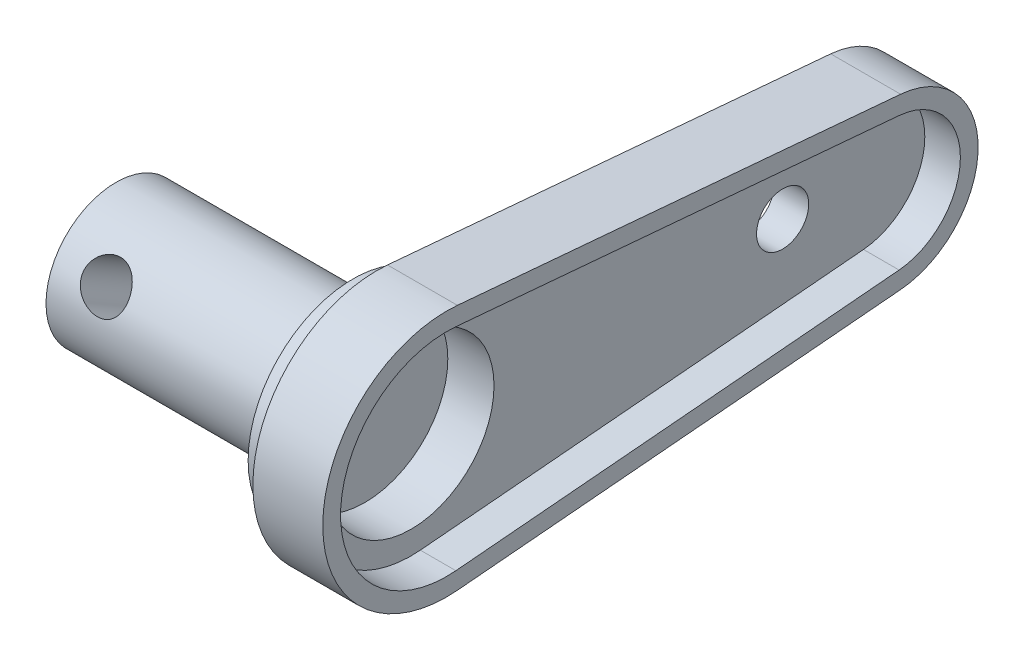
ISO-10303-21;
HEADER;
FILE_DESCRIPTION(('STEP AP214'),'2;1');
FILE_NAME('part.step','',(''),(''),'','','');
FILE_SCHEMA(('AUTOMOTIVE_DESIGN { 1 0 10303 214 1 1 1 1 }'));
ENDSEC;
DATA;
#1=APPLICATION_CONTEXT('core data for automotive mechanical design processes');
#2=APPLICATION_PROTOCOL_DEFINITION('international standard','automotive_design',2000,#1);
#3=PRODUCT_CONTEXT('',#1,'mechanical');
#4=PRODUCT('Part','Part','',(#3));
#5=PRODUCT_RELATED_PRODUCT_CATEGORY('part','',(#4));
#6=PRODUCT_DEFINITION_FORMATION('','',#4);
#7=PRODUCT_DEFINITION_CONTEXT('part definition',#1,'design');
#8=PRODUCT_DEFINITION('design','',#6,#7);
#9=PRODUCT_DEFINITION_SHAPE('','',#8);
#10=(LENGTH_UNIT() NAMED_UNIT(*) SI_UNIT(.MILLI.,.METRE.));
#11=(NAMED_UNIT(*) PLANE_ANGLE_UNIT() SI_UNIT($,.RADIAN.));
#12=(NAMED_UNIT(*) SI_UNIT($,.STERADIAN.) SOLID_ANGLE_UNIT());
#13=UNCERTAINTY_MEASURE_WITH_UNIT(LENGTH_MEASURE(1.E-05),#10,'distance_accuracy_value','');
#14=(GEOMETRIC_REPRESENTATION_CONTEXT(3) GLOBAL_UNCERTAINTY_ASSIGNED_CONTEXT((#13)) GLOBAL_UNIT_ASSIGNED_CONTEXT((#10,
#11,#12)) REPRESENTATION_CONTEXT('',''));
#15=CARTESIAN_POINT('',(0.,0.,0.));
#16=DIRECTION('',(0.,0.,1.));
#17=DIRECTION('',(1.,0.,0.));
#18=AXIS2_PLACEMENT_3D('',#15,#16,#17);
#19=CARTESIAN_POINT('',(0.,0.,-5.3086));
#20=DIRECTION('',(1.,0.,0.));
#21=DIRECTION('',(0.,0.,-1.));
#22=AXIS2_PLACEMENT_3D('',#19,#20,#21);
#23=PLANE('',#22);
#24=CARTESIAN_POINT('',(0.,0.,-21.2344));
#25=DIRECTION('',(1.,0.,0.));
#26=DIRECTION('',(0.,0.,-1.));
#27=AXIS2_PLACEMENT_3D('',#24,#25,#26);
#28=CIRCLE('',#27,1.1176);
#29=CARTESIAN_POINT('',(0.,0.,-22.352));
#30=VERTEX_POINT('',#29);
#31=EDGE_CURVE('E386',#30,#30,#28,.T.);
#32=ORIENTED_EDGE('',*,*,#31,.T.);
#33=EDGE_LOOP('',(#32));
#34=FACE_BOUND('',#33,.T.);
#35=CARTESIAN_POINT('',(0.,0.,-5.3086));
#36=DIRECTION('',(1.,0.,0.));
#37=DIRECTION('',(0.,0.,-1.));
#38=AXIS2_PLACEMENT_3D('',#35,#36,#37);
#39=CIRCLE('',#38,5.3086);
#40=CARTESIAN_POINT('',(0.,5.28839917428984,-5.77127497595018));
#41=VERTEX_POINT('',#40);
#42=CARTESIAN_POINT('',(0.,-5.28839917428984,-5.77127497595018));
#43=VERTEX_POINT('',#42);
#44=EDGE_CURVE('E164',#41,#43,#39,.T.);
#45=ORIENTED_EDGE('',*,*,#44,.F.);
#46=DIRECTION('',(0.,0.0871557427476513,0.996194698091746));
#47=VECTOR('',#46,1.);
#48=CARTESIAN_POINT('',(0.,3.62626644449713,-24.7695390116139));
#49=LINE('',#48,#47);
#50=CARTESIAN_POINT('',(0.,3.62626644449713,-24.7695390116139));
#51=VERTEX_POINT('',#50);
#52=EDGE_CURVE('E85',#51,#41,#49,.T.);
#53=ORIENTED_EDGE('',*,*,#52,.F.);
#54=CARTESIAN_POINT('',(0.,0.,-24.452281806796));
#55=DIRECTION('',(1.,0.,0.));
#56=DIRECTION('',(0.,0.,-1.));
#57=AXIS2_PLACEMENT_3D('',#54,#55,#56);
#58=CIRCLE('',#57,3.64011819320399);
#59=CARTESIAN_POINT('',(0.,-3.62626644449712,-24.7695390116139));
#60=VERTEX_POINT('',#59);
#61=EDGE_CURVE('E176',#60,#51,#58,.T.);
#62=ORIENTED_EDGE('',*,*,#61,.F.);
#63=DIRECTION('',(0.,0.0871557427476515,-0.996194698091746));
#64=VECTOR('',#63,1.);
#65=CARTESIAN_POINT('',(0.,-3.62626644449712,-24.7695390116139));
#66=LINE('',#65,#64);
#67=EDGE_CURVE('E174',#43,#60,#66,.T.);
#68=ORIENTED_EDGE('',*,*,#67,.F.);
#69=EDGE_LOOP('',(#45,#53,#62,#68));
#70=FACE_BOUND('',#69,.T.);
#71=CARTESIAN_POINT('',(0.,0.,-5.3086));
#72=DIRECTION('',(1.,0.,0.));
#73=DIRECTION('',(0.,0.,-1.));
#74=AXIS2_PLACEMENT_3D('',#71,#72,#73);
#75=CIRCLE('',#74,4.4958);
#76=CARTESIAN_POINT('',(0.,0.,-9.8044));
#77=VERTEX_POINT('',#76);
#78=EDGE_CURVE('E11',#77,#77,#75,.F.);
#79=ORIENTED_EDGE('',*,*,#78,.F.);
#80=EDGE_LOOP('',(#79));
#81=FACE_BOUND('',#80,.T.);
#82=ADVANCED_FACE('F33',(#34,#70,#81),#23,.F.);
#83=CARTESIAN_POINT('',(2.9972,0.,-5.3086));
#84=DIRECTION('',(-1.,0.,0.));
#85=DIRECTION('',(0.,0.,1.));
#86=AXIS2_PLACEMENT_3D('',#83,#84,#85);
#87=CYLINDRICAL_SURFACE('',#86,5.3086);
#88=ORIENTED_EDGE('',*,*,#44,.T.);
#89=DIRECTION('',(-1.,0.,0.));
#90=VECTOR('',#89,1.);
#91=CARTESIAN_POINT('',(2.9972,-5.28839917428984,-5.77127497595018));
#92=LINE('',#91,#90);
#93=CARTESIAN_POINT('',(2.9972,-5.28839917428984,-5.77127497595018));
#94=VERTEX_POINT('',#93);
#95=EDGE_CURVE('E47',#94,#43,#92,.T.);
#96=ORIENTED_EDGE('',*,*,#95,.F.);
#97=CARTESIAN_POINT('',(2.9972,0.,-5.3086));
#98=DIRECTION('',(1.,0.,0.));
#99=DIRECTION('',(0.,0.,-1.));
#100=AXIS2_PLACEMENT_3D('',#97,#98,#99);
#101=CIRCLE('',#100,5.3086);
#102=CARTESIAN_POINT('',(2.9972,5.28839917428984,-5.77127497595018));
#103=VERTEX_POINT('',#102);
#104=EDGE_CURVE('E165',#103,#94,#101,.T.);
#105=ORIENTED_EDGE('',*,*,#104,.F.);
#106=DIRECTION('',(-1.,0.,0.));
#107=VECTOR('',#106,1.);
#108=CARTESIAN_POINT('',(2.9972,5.28839917428984,-5.77127497595018));
#109=LINE('',#108,#107);
#110=EDGE_CURVE('E171',#103,#41,#109,.T.);
#111=ORIENTED_EDGE('',*,*,#110,.T.);
#112=EDGE_LOOP('',(#88,#96,#105,#111));
#113=FACE_BOUND('',#112,.T.);
#114=ADVANCED_FACE('F35',(#113),#87,.T.);
#115=CARTESIAN_POINT('',(2.9972,-3.62626644449712,-24.7695390116139));
#116=DIRECTION('',(0.,0.996194698091746,0.0871557427476515));
#117=DIRECTION('',(0.,-0.0871557427476515,0.996194698091746));
#118=AXIS2_PLACEMENT_3D('',#115,#116,#117);
#119=PLANE('',#118);
#120=ORIENTED_EDGE('',*,*,#67,.T.);
#121=DIRECTION('',(-1.,0.,0.));
#122=VECTOR('',#121,1.);
#123=CARTESIAN_POINT('',(2.9972,-3.62626644449712,-24.7695390116139));
#124=LINE('',#123,#122);
#125=CARTESIAN_POINT('',(2.9972,-3.62626644449712,-24.7695390116139));
#126=VERTEX_POINT('',#125);
#127=EDGE_CURVE('E182',#126,#60,#124,.T.);
#128=ORIENTED_EDGE('',*,*,#127,.F.);
#129=DIRECTION('',(0.,0.0871557427476515,-0.996194698091746));
#130=VECTOR('',#129,1.);
#131=CARTESIAN_POINT('',(2.9972,-3.62626644449712,-24.7695390116139));
#132=LINE('',#131,#130);
#133=EDGE_CURVE('E93',#94,#126,#132,.T.);
#134=ORIENTED_EDGE('',*,*,#133,.F.);
#135=ORIENTED_EDGE('',*,*,#95,.T.);
#136=EDGE_LOOP('',(#120,#128,#134,#135));
#137=FACE_BOUND('',#136,.T.);
#138=ADVANCED_FACE('F251',(#137),#119,.F.);
#139=CARTESIAN_POINT('',(2.9972,0.,-24.452281806796));
#140=DIRECTION('',(-1.,0.,0.));
#141=DIRECTION('',(0.,0.,1.));
#142=AXIS2_PLACEMENT_3D('',#139,#140,#141);
#143=CYLINDRICAL_SURFACE('',#142,3.64011819320399);
#144=ORIENTED_EDGE('',*,*,#61,.T.);
#145=DIRECTION('',(-1.,0.,0.));
#146=VECTOR('',#145,1.);
#147=CARTESIAN_POINT('',(2.9972,3.62626644449713,-24.7695390116139));
#148=LINE('',#147,#146);
#149=CARTESIAN_POINT('',(2.9972,3.62626644449713,-24.7695390116139));
#150=VERTEX_POINT('',#149);
#151=EDGE_CURVE('E180',#150,#51,#148,.T.);
#152=ORIENTED_EDGE('',*,*,#151,.F.);
#153=CARTESIAN_POINT('',(2.9972,0.,-24.452281806796));
#154=DIRECTION('',(1.,0.,0.));
#155=DIRECTION('',(0.,0.,-1.));
#156=AXIS2_PLACEMENT_3D('',#153,#154,#155);
#157=CIRCLE('',#156,3.64011819320399);
#158=EDGE_CURVE('E168',#126,#150,#157,.T.);
#159=ORIENTED_EDGE('',*,*,#158,.F.);
#160=ORIENTED_EDGE('',*,*,#127,.T.);
#161=EDGE_LOOP('',(#144,#152,#159,#160));
#162=FACE_BOUND('',#161,.T.);
#163=ADVANCED_FACE('F259',(#162),#143,.T.);
#164=CARTESIAN_POINT('',(2.9972,3.62626644449713,-24.7695390116139));
#165=DIRECTION('',(0.,-0.996194698091746,0.0871557427476513));
#166=DIRECTION('',(0.,-0.0871557427476513,-0.996194698091746));
#167=AXIS2_PLACEMENT_3D('',#164,#165,#166);
#168=PLANE('',#167);
#169=ORIENTED_EDGE('',*,*,#52,.T.);
#170=ORIENTED_EDGE('',*,*,#110,.F.);
#171=DIRECTION('',(0.,0.0871557427476513,0.996194698091746));
#172=VECTOR('',#171,1.);
#173=CARTESIAN_POINT('',(2.9972,3.62626644449713,-24.7695390116139));
#174=LINE('',#173,#172);
#175=EDGE_CURVE('E64',#150,#103,#174,.T.);
#176=ORIENTED_EDGE('',*,*,#175,.F.);
#177=ORIENTED_EDGE('',*,*,#151,.T.);
#178=EDGE_LOOP('',(#169,#170,#176,#177));
#179=FACE_BOUND('',#178,.T.);
#180=ADVANCED_FACE('F256',(#179),#168,.F.);
#181=CARTESIAN_POINT('',(2.9972,0.,-5.3086));
#182=DIRECTION('',(1.,0.,0.));
#183=DIRECTION('',(0.,0.,-1.));
#184=AXIS2_PLACEMENT_3D('',#181,#182,#183);
#185=PLANE('',#184);
#186=CARTESIAN_POINT('',(2.9972,0.,-24.452281806796));
#187=DIRECTION('',(1.,0.,0.));
#188=DIRECTION('',(0.,0.,-1.));
#189=AXIS2_PLACEMENT_3D('',#186,#187,#188);
#190=CIRCLE('',#189,2.87811819320399);
#191=CARTESIAN_POINT('',(2.9972,-2.86716608455121,-24.7031263356402));
#192=VERTEX_POINT('',#191);
#193=CARTESIAN_POINT('',(2.9972,2.86716608455121,-24.7031263356402));
#194=VERTEX_POINT('',#193);
#195=EDGE_CURVE('E55',#192,#194,#190,.T.);
#196=ORIENTED_EDGE('',*,*,#195,.F.);
#197=DIRECTION('',(0.,0.0871557427476516,-0.996194698091746));
#198=VECTOR('',#197,1.);
#199=CARTESIAN_POINT('',(2.9972,-4.52929881434393,-5.70486229997647));
#200=LINE('',#199,#198);
#201=CARTESIAN_POINT('',(2.9972,-4.52929881434393,-5.70486229997647));
#202=VERTEX_POINT('',#201);
#203=EDGE_CURVE('E135',#202,#192,#200,.T.);
#204=ORIENTED_EDGE('',*,*,#203,.F.);
#205=CARTESIAN_POINT('',(2.9972,0.,-5.3086));
#206=DIRECTION('',(1.,0.,0.));
#207=DIRECTION('',(0.,0.,-1.));
#208=AXIS2_PLACEMENT_3D('',#205,#206,#207);
#209=CIRCLE('',#208,4.5466);
#210=CARTESIAN_POINT('',(2.9972,4.52929881434393,-5.70486229997647));
#211=VERTEX_POINT('',#210);
#212=EDGE_CURVE('E138',#211,#202,#209,.T.);
#213=ORIENTED_EDGE('',*,*,#212,.F.);
#214=DIRECTION('',(0.,0.0871557427476513,0.996194698091746));
#215=VECTOR('',#214,1.);
#216=CARTESIAN_POINT('',(2.9972,2.86716608455122,-24.7031263356402));
#217=LINE('',#216,#215);
#218=EDGE_CURVE('E147',#194,#211,#217,.T.);
#219=ORIENTED_EDGE('',*,*,#218,.F.);
#220=EDGE_LOOP('',(#196,#204,#213,#219));
#221=FACE_BOUND('',#220,.T.);
#222=ORIENTED_EDGE('',*,*,#104,.T.);
#223=ORIENTED_EDGE('',*,*,#133,.T.);
#224=ORIENTED_EDGE('',*,*,#158,.T.);
#225=ORIENTED_EDGE('',*,*,#175,.T.);
#226=EDGE_LOOP('',(#222,#223,#224,#225));
#227=FACE_BOUND('',#226,.T.);
#228=ADVANCED_FACE('F233',(#221,#227),#185,.T.);
#229=CARTESIAN_POINT('',(-1.016,0.,-5.3086));
#230=DIRECTION('',(-1.,0.,0.));
#231=DIRECTION('',(0.,0.,1.));
#232=AXIS2_PLACEMENT_3D('',#229,#230,#231);
#233=PLANE('',#232);
#234=CARTESIAN_POINT('',(-1.016,0.,-5.3086));
#235=DIRECTION('',(-1.,0.,0.));
#236=DIRECTION('',(0.,0.,1.));
#237=AXIS2_PLACEMENT_3D('',#234,#235,#236);
#238=CIRCLE('',#237,4.4958);
#239=CARTESIAN_POINT('',(-1.016,0.,-0.8128));
#240=VERTEX_POINT('',#239);
#241=EDGE_CURVE('E154',#240,#240,#238,.T.);
#242=ORIENTED_EDGE('',*,*,#241,.T.);
#243=EDGE_LOOP('',(#242));
#244=FACE_BOUND('',#243,.T.);
#245=CARTESIAN_POINT('',(-1.016,0.,-5.3086));
#246=DIRECTION('',(-1.,0.,0.));
#247=DIRECTION('',(0.,0.,1.));
#248=AXIS2_PLACEMENT_3D('',#245,#246,#247);
#249=CIRCLE('',#248,3.);
#250=CARTESIAN_POINT('',(-1.016,0.,-2.3086));
#251=VERTEX_POINT('',#250);
#252=EDGE_CURVE('E160',#251,#251,#249,.T.);
#253=ORIENTED_EDGE('',*,*,#252,.F.);
#254=EDGE_LOOP('',(#253));
#255=FACE_BOUND('',#254,.T.);
#256=ADVANCED_FACE('F229',(#244,#255),#233,.T.);
#257=CARTESIAN_POINT('',(-1.016,0.,-5.3086));
#258=DIRECTION('',(1.,0.,0.));
#259=DIRECTION('',(0.,0.,-1.));
#260=AXIS2_PLACEMENT_3D('',#257,#258,#259);
#261=CYLINDRICAL_SURFACE('',#260,4.4958);
#262=ORIENTED_EDGE('',*,*,#241,.F.);
#263=EDGE_LOOP('',(#262));
#264=FACE_BOUND('',#263,.T.);
#265=ORIENTED_EDGE('',*,*,#78,.T.);
#266=EDGE_LOOP('',(#265));
#267=FACE_BOUND('',#266,.T.);
#268=ADVANCED_FACE('F232',(#264,#267),#261,.T.);
#269=CARTESIAN_POINT('',(-11.176,0.,-5.3086));
#270=DIRECTION('',(-1.,0.,0.));
#271=DIRECTION('',(0.,0.,1.));
#272=AXIS2_PLACEMENT_3D('',#269,#270,#271);
#273=PLANE('',#272);
#274=CARTESIAN_POINT('',(-11.176,0.,-5.3086));
#275=DIRECTION('',(-1.,0.,0.));
#276=DIRECTION('',(0.,0.,1.));
#277=AXIS2_PLACEMENT_3D('',#274,#275,#276);
#278=CIRCLE('',#277,3.);
#279=CARTESIAN_POINT('',(-11.176,0.,-2.3086));
#280=VERTEX_POINT('',#279);
#281=EDGE_CURVE('E161',#280,#280,#278,.T.);
#282=ORIENTED_EDGE('',*,*,#281,.T.);
#283=EDGE_LOOP('',(#282));
#284=FACE_BOUND('',#283,.T.);
#285=ADVANCED_FACE('F236',(#284),#273,.T.);
#286=CARTESIAN_POINT('',(-11.176,0.,-5.3086));
#287=DIRECTION('',(1.,0.,0.));
#288=DIRECTION('',(0.,0.,-1.));
#289=AXIS2_PLACEMENT_3D('',#286,#287,#288);
#290=CYLINDRICAL_SURFACE('',#289,3.);
#291=CARTESIAN_POINT('',(-9.02281429492282,2.27375125233858,-3.35154730717624));
#292=CARTESIAN_POINT('',(-8.96882599333698,2.2737513401527,-3.351547460472));
#293=CARTESIAN_POINT('',(-8.91483841117992,2.27069646086252,-3.34798131268195));
#294=CARTESIAN_POINT('',(-8.80846063520607,2.25852863410597,-3.33397789945316));
#295=CARTESIAN_POINT('',(-8.75607073137423,2.2494145936421,-3.32353939432971));
#296=CARTESIAN_POINT('',(-8.6544462334213,2.22528838666123,-3.29653248021309));
#297=CARTESIAN_POINT('',(-8.60520576191764,2.21028760288604,-3.2799759048454));
#298=CARTESIAN_POINT('',(-8.5109764196512,2.17456874030488,-3.24173452135225));
#299=CARTESIAN_POINT('',(-8.46598846212337,2.15384943716452,-3.22004861517998));
#300=CARTESIAN_POINT('',(-8.37981423361891,2.106082992887,-3.17187306841398));
#301=CARTESIAN_POINT('',(-8.33881503710414,2.07884052811069,-3.14524238094658));
#302=CARTESIAN_POINT('',(-8.26346092665725,2.01874272341074,-3.08905772329985));
#303=CARTESIAN_POINT('',(-8.22910705737631,1.98588650252618,-3.05950329460777));
#304=CARTESIAN_POINT('',(-8.16717354673548,1.91406745026138,-2.99805193824378));
#305=CARTESIAN_POINT('',(-8.13978940075846,1.87497005005964,-2.96611445414099));
#306=CARTESIAN_POINT('',(-8.0938652261702,1.79201367809266,-2.9020613996955));
#307=CARTESIAN_POINT('',(-8.07532286140982,1.74815596784623,-2.86994587866437));
#308=CARTESIAN_POINT('',(-8.04824148741459,1.65828753952057,-2.80800860465632));
#309=CARTESIAN_POINT('',(-8.03938211765242,1.61240171291006,-2.77814596914899));
#310=CARTESIAN_POINT('',(-8.03090014227165,1.51842931852543,-2.72066590038311));
#311=CARTESIAN_POINT('',(-8.03127519939964,1.47034331069736,-2.69304790077784));
#312=CARTESIAN_POINT('',(-8.04104706980799,1.37533616137332,-2.64190706967833));
#313=CARTESIAN_POINT('',(-8.05009602319561,1.32844143857471,-2.61826751831073));
#314=CARTESIAN_POINT('',(-8.07638425381781,1.2354086726359,-2.57429676970305));
#315=CARTESIAN_POINT('',(-8.09362408337833,1.18927068074054,-2.5539657956906));
#316=CARTESIAN_POINT('',(-8.13601089731258,1.09855272466346,-2.51653567921448));
#317=CARTESIAN_POINT('',(-8.16125787482924,1.05400085419633,-2.49948204380511));
#318=CARTESIAN_POINT('',(-8.2188602494711,0.968436924348443,-2.46884679162985));
#319=CARTESIAN_POINT('',(-8.25121759692587,0.927425840490518,-2.45526612969442));
#320=CARTESIAN_POINT('',(-8.32388026522002,0.848413710361817,-2.43075619620752));
#321=CARTESIAN_POINT('',(-8.36448398348211,0.810639628375747,-2.41997861557512));
#322=CARTESIAN_POINT('',(-8.45158739531225,0.741695252439023,-2.40151121061367));
#323=CARTESIAN_POINT('',(-8.49808796092097,0.710525937042571,-2.39382184367971));
#324=CARTESIAN_POINT('',(-8.59651380394118,0.655687724294921,-2.38099332890171));
#325=CARTESIAN_POINT('',(-8.64850491408149,0.632127920104444,-2.37589072329457));
#326=CARTESIAN_POINT('',(-8.75591831972087,0.594271814729807,-2.3679845199029));
#327=CARTESIAN_POINT('',(-8.8113391991853,0.579971718115503,-2.36517998004671));
#328=CARTESIAN_POINT('',(-8.92140471924148,0.56183968274621,-2.36166630828682));
#329=CARTESIAN_POINT('',(-8.97597471303855,0.557571465253198,-2.36086973262502));
#330=CARTESIAN_POINT('',(-9.08502988054923,0.558454088841843,-2.36103663919855));
#331=CARTESIAN_POINT('',(-9.1395150675868,0.563603259946168,-2.36199980937966));
#332=CARTESIAN_POINT('',(-9.24495233717637,0.582702490105141,-2.36571944391878));
#333=CARTESIAN_POINT('',(-9.29596163406785,0.596352045731576,-2.36841477332805));
#334=CARTESIAN_POINT('',(-9.39503708757096,0.631520909990904,-2.37576828413802));
#335=CARTESIAN_POINT('',(-9.44310272691563,0.653041597153053,-2.38042680938942));
#336=CARTESIAN_POINT('',(-9.53659148499556,0.703834260102685,-2.39221260935258));
#337=CARTESIAN_POINT('',(-9.58188500473392,0.733327539388653,-2.3994125144253));
#338=CARTESIAN_POINT('',(-9.66709163510137,0.79859790392257,-2.41664928388353));
#339=CARTESIAN_POINT('',(-9.70700318258783,0.834376807851948,-2.42668696986553));
#340=CARTESIAN_POINT('',(-9.78225395549449,0.91282034865769,-2.4505386965886));
#341=CARTESIAN_POINT('',(-9.81728954802053,0.955729819987472,-2.46450824633636));
#342=CARTESIAN_POINT('',(-9.87947398616785,1.04564165915334,-2.49632258228216));
#343=CARTESIAN_POINT('',(-9.90662312679205,1.09264387380956,-2.51416722348375));
#344=CARTESIAN_POINT('',(-9.95201312308183,1.18882541513841,-2.55371767922223));
#345=CARTESIAN_POINT('',(-9.9703132087891,1.23798779404763,-2.57539645633666));
#346=CARTESIAN_POINT('',(-9.99759761191331,1.33709699823069,-2.62249193454805));
#347=CARTESIAN_POINT('',(-10.0065852221715,1.38704353988283,-2.64790731077135));
#348=CARTESIAN_POINT('',(-10.0146975507053,1.48373369655413,-2.70064536498203));
#349=CARTESIAN_POINT('',(-10.0142585525912,1.53051870989371,-2.72782577153506));
#350=CARTESIAN_POINT('',(-10.0046030801775,1.62188427078871,-2.78424392184953));
#351=CARTESIAN_POINT('',(-9.99538729562462,1.66646499128466,-2.81348150377524));
#352=CARTESIAN_POINT('',(-9.96872760935794,1.75160689286988,-2.87251325443431));
#353=CARTESIAN_POINT('',(-9.95141209694069,1.79221924357885,-2.9022920048344));
#354=CARTESIAN_POINT('',(-9.90916285877788,1.86936648313467,-2.96172064694866));
#355=CARTESIAN_POINT('',(-9.88422776404692,1.90590063765364,-2.9913705145352));
#356=CARTESIAN_POINT('',(-9.82639839922083,1.97556462971222,-3.05043549408569));
#357=CARTESIAN_POINT('',(-9.7932467779901,2.00852147670584,-3.07980251258378));
#358=CARTESIAN_POINT('',(-9.72036563262097,2.06902090854903,-3.13584684037003));
#359=CARTESIAN_POINT('',(-9.68063402978038,2.09656177638644,-3.16252329537522));
#360=CARTESIAN_POINT('',(-9.59390507397892,2.14687860510665,-3.21283563253933));
#361=CARTESIAN_POINT('',(-9.54668813040998,2.16943233036822,-3.23631641717761));
#362=CARTESIAN_POINT('',(-9.4473882211295,2.20812114283178,-3.27758910280712));
#363=CARTESIAN_POINT('',(-9.39530664393795,2.2242580547231,-3.29538262075051));
#364=CARTESIAN_POINT('',(-9.29048532305581,2.24924197398837,-3.32334288912259));
#365=CARTESIAN_POINT('',(-9.23791702654396,2.25842106808866,-3.33385466490221));
#366=CARTESIAN_POINT('',(-9.13116998718577,2.27067466144348,-3.34795566103203));
#367=CARTESIAN_POINT('',(-9.07699177881452,2.27375116421675,-3.35154715334331));
#368=CARTESIAN_POINT('',(-9.02281429492282,2.27375125233858,-3.35154730717624));
#369=B_SPLINE_CURVE_WITH_KNOTS('',3,(#291,#292,#293,#294,#295,#296,#297,#298,#299,#300,#301,
#302,#303,#304,#305,#306,#307,#308,#309,#310,#311,#312,#313,#314,#315,#316,#317,#318,#319,#320,
#321,#322,#323,#324,#325,#326,#327,#328,#329,#330,#331,#332,#333,#334,#335,#336,#337,#338,#339,
#340,#341,#342,#343,#344,#345,#346,#347,#348,#349,#350,#351,#352,#353,#354,#355,#356,#357,#358,
#359,#360,#361,#362,#363,#364,#365,#366,#367,#368),.UNSPECIFIED.,.T.,.F.,(4,2,2,2,2,2,2,2,2,2,2,
2,2,2,2,2,2,2,2,2,2,2,2,2,2,2,2,2,2,2,2,2,2,2,2,2,2,2,4),(0.,0.161764353083448,
0.323557894370165,0.485040117364984,0.646556940541795,0.813701386305407,0.980872086005241,
1.15231375342525,1.32371009790358,1.48924598908346,1.65473998320213,1.81386307380458,
1.97299689589496,2.13420188269334,2.29545114231804,2.4641587673663,2.63289137048183,
2.80394544926635,2.97492937081837,3.13832749541807,3.30169664757974,3.45959480828861,
3.61752063611802,3.78038391476333,3.9432943940826,4.11387280117939,4.28444482674847,
4.45385877865095,4.62321280622759,4.78474639914285,4.94626729856508,5.10531044155265,
5.26438217611829,5.42926161007596,5.59419323131178,5.76542589931705,5.93660984060672,
6.09899435852551,6.26132555576637),.UNSPECIFIED.);
#370=CARTESIAN_POINT('',(-9.02281429492282,2.27375125233858,-3.35154730717624));
#371=VERTEX_POINT('',#370);
#372=EDGE_CURVE('E37',#371,#371,#369,.T.);
#373=ORIENTED_EDGE('',*,*,#372,.T.);
#374=EDGE_LOOP('',(#373));
#375=FACE_BOUND('',#374,.T.);
#376=CARTESIAN_POINT('',(-9.02281429492282,-0.557981722360858,-8.25625269282377));
#377=CARTESIAN_POINT('',(-9.07680259650865,-0.557981545695774,-8.25625269222515));
#378=CARTESIAN_POINT('',(-9.13079017866572,-0.562597359920702,-8.25539016304938));
#379=CARTESIAN_POINT('',(-9.23716795463957,-0.580808584894789,-8.25185422258375));
#380=CARTESIAN_POINT('',(-9.28955785847141,-0.594405615741168,-8.24918048457264));
#381=CARTESIAN_POINT('',(-9.39118235642434,-0.629857392934425,-8.24179003348856));
#382=CARTESIAN_POINT('',(-9.440422827928,-0.651696199690114,-8.23707726134642));
#383=CARTESIAN_POINT('',(-9.53465217019444,-0.70267364056162,-8.22526451070342));
#384=CARTESIAN_POINT('',(-9.57964012772227,-0.731813837781073,-8.21816402092129));
#385=CARTESIAN_POINT('',(-9.66581435622673,-0.797418307260397,-8.20088484011151));
#386=CARTESIAN_POINT('',(-9.7068135527415,-0.834102391515563,-8.19060751728721));
#387=CARTESIAN_POINT('',(-9.78216766318839,-0.912808634690539,-8.16665362052874));
#388=CARTESIAN_POINT('',(-9.81652153246933,-0.954831631174491,-8.15297651291641));
#389=CARTESIAN_POINT('',(-9.87845504311016,-1.04395959301512,-8.12150506736136));
#390=CARTESIAN_POINT('',(-9.90583918908718,-1.09116696568196,-8.10361446761612));
#391=CARTESIAN_POINT('',(-9.95176336367544,-1.18811672400523,-8.06379866930967));
#392=CARTESIAN_POINT('',(-9.97030572843582,-1.23785843619718,-8.04187453860001));
#393=CARTESIAN_POINT('',(-9.99738710243105,-1.33643190309215,-7.99501483367583));
#394=CARTESIAN_POINT('',(-10.0062464721932,-1.3852366173707,-7.97020785991114));
#395=CARTESIAN_POINT('',(-10.014728447574,-1.48200201432554,-7.91756541350255));
#396=CARTESIAN_POINT('',(-10.014353390446,-1.52996290749946,-7.8897307089595));
#397=CARTESIAN_POINT('',(-10.0045815200377,-1.62175574106429,-7.83302251965349));
#398=CARTESIAN_POINT('',(-9.99553256665003,-1.66567555448201,-7.80423027409027));
#399=CARTESIAN_POINT('',(-9.96924433602783,-1.75027172276909,-7.74564690970676));
#400=CARTESIAN_POINT('',(-9.95200450646731,-1.79094785869523,-7.715855723652));
#401=CARTESIAN_POINT('',(-9.90961769253306,-1.86872226846869,-7.65600672734791));
#402=CARTESIAN_POINT('',(-9.8843707150164,-1.90576708519365,-7.62595049344194));
#403=CARTESIAN_POINT('',(-9.82676834037454,-1.97507995675272,-7.56716758263368));
#404=CARTESIAN_POINT('',(-9.79441099291977,-2.00734669691797,-7.53844127314369));
#405=CARTESIAN_POINT('',(-9.72174832462561,-2.06807898702704,-7.48226972798857));
#406=CARTESIAN_POINT('',(-9.68114460636353,-2.09629968663907,-7.45494520370019));
#407=CARTESIAN_POINT('',(-9.59404119453339,-2.14676511644602,-7.40447132517165));
#408=CARTESIAN_POINT('',(-9.54754062892467,-2.16900896124808,-7.38132258968673));
#409=CARTESIAN_POINT('',(-9.44911478590446,-2.20753788731247,-7.34024556173813));
#410=CARTESIAN_POINT('',(-9.39712367576415,-2.22373677548899,-7.32239347560456));
#411=CARTESIAN_POINT('',(-9.28971027012477,-2.24951180116098,-7.29356222835762));
#412=CARTESIAN_POINT('',(-9.23428939066034,-2.25909065222952,-7.28258025134116));
#413=CARTESIAN_POINT('',(-9.12422387060415,-2.27119959891879,-7.26863428396898));
#414=CARTESIAN_POINT('',(-9.06965387680709,-2.27402356242445,-7.26533618702205));
#415=CARTESIAN_POINT('',(-8.96059870929641,-2.27343770529739,-7.26601710818503));
#416=CARTESIAN_POINT('',(-8.90611352225883,-2.27002898990021,-7.26999483607925));
#417=CARTESIAN_POINT('',(-8.80067625266927,-2.25725807681706,-7.28467543732009));
#418=CARTESIAN_POINT('',(-8.74966695577779,-2.24809907526384,-7.29514863453832));
#419=CARTESIAN_POINT('',(-8.65059150227467,-2.22414631596575,-7.32192900900416));
#420=CARTESIAN_POINT('',(-8.60252586293001,-2.20935157117279,-7.33823720816778));
#421=CARTESIAN_POINT('',(-8.50903710485008,-2.17374843752596,-7.37633204462644));
#422=CARTESIAN_POINT('',(-8.46374358511172,-2.15276649718516,-7.39827402119263));
#423=CARTESIAN_POINT('',(-8.37853695474427,-2.1052038346882,-7.44618143026416));
#424=CARTESIAN_POINT('',(-8.33862540725781,-2.07862149166788,-7.47214802699557));
#425=CARTESIAN_POINT('',(-8.26337463435115,-2.01874351999871,-7.52815626273461));
#426=CARTESIAN_POINT('',(-8.22833904182511,-1.98519079937283,-7.55833218009528));
#427=CARTESIAN_POINT('',(-8.16615460367779,-1.9126828566563,-7.620290948941));
#428=CARTESIAN_POINT('',(-8.13900546305359,-1.8737278367262,-7.65207374026663));
#429=CARTESIAN_POINT('',(-8.09361546676381,-1.791385366661,-7.71559417056331));
#430=CARTESIAN_POINT('',(-8.07531538105654,-1.74802980550231,-7.74733065105195));
#431=CARTESIAN_POINT('',(-8.04803097793232,-1.65768932287634,-7.80961400051765));
#432=CARTESIAN_POINT('',(-8.03904336767417,-1.61070569059415,-7.84016128630793));
#433=CARTESIAN_POINT('',(-8.03093103914031,-1.51668811756589,-7.89752839117584));
#434=CARTESIAN_POINT('',(-8.03137003725442,-1.46975668833599,-7.92445519796779));
#435=CARTESIAN_POINT('',(-8.04102550966815,-1.37521435648163,-7.97537101957664));
#436=CARTESIAN_POINT('',(-8.05024129422103,-1.32760350754076,-7.9993602650823));
#437=CARTESIAN_POINT('',(-8.0769009804877,-1.23390956104753,-8.04357943945207));
#438=CARTESIAN_POINT('',(-8.09421649290494,-1.18781423135361,-8.0638613916734));
#439=CARTESIAN_POINT('',(-8.13646573106776,-1.09777389779234,-8.10095853990346));
#440=CARTESIAN_POINT('',(-8.16140082579872,-1.05382928198406,-8.1177731120294));
#441=CARTESIAN_POINT('',(-8.21923019062481,-0.967845513190041,-8.14857140910593));
#442=CARTESIAN_POINT('',(-8.25238181185554,-0.925934505640481,-8.16242936658199));
#443=CARTESIAN_POINT('',(-8.32526295722467,-0.847148978117971,-8.18680124757959));
#444=CARTESIAN_POINT('',(-8.36499456006526,-0.810276056481854,-8.19731411126647));
#445=CARTESIAN_POINT('',(-8.45172351586672,-0.741545880013874,-8.21573359459398));
#446=CARTESIAN_POINT('',(-8.49894045943566,-0.709934061385538,-8.22352530130134));
#447=CARTESIAN_POINT('',(-8.59824036871614,-0.654846460916197,-8.23639445292228));
#448=CARTESIAN_POINT('',(-8.65032194590769,-0.631368366408869,-8.24147266958711));
#449=CARTESIAN_POINT('',(-8.75514326678983,-0.594662104069379,-8.24912924417088));
#450=CARTESIAN_POINT('',(-8.80771156330168,-0.580969092155199,-8.25182268495566));
#451=CARTESIAN_POINT('',(-8.91445860265986,-0.562630474610698,-8.25538411002366));
#452=CARTESIAN_POINT('',(-8.96863681103112,-0.557981899645001,-8.25625269342449));
#453=CARTESIAN_POINT('',(-9.02281429492282,-0.557981722360858,-8.25625269282377));
#454=B_SPLINE_CURVE_WITH_KNOTS('',3,(#376,#377,#378,#379,#380,#381,#382,#383,#384,#385,#386,
#387,#388,#389,#390,#391,#392,#393,#394,#395,#396,#397,#398,#399,#400,#401,#402,#403,#404,#405,
#406,#407,#408,#409,#410,#411,#412,#413,#414,#415,#416,#417,#418,#419,#420,#421,#422,#423,#424,
#425,#426,#427,#428,#429,#430,#431,#432,#433,#434,#435,#436,#437,#438,#439,#440,#441,#442,#443,
#444,#445,#446,#447,#448,#449,#450,#451,#452,#453),.UNSPECIFIED.,.T.,.F.,(4,2,2,2,2,2,2,2,2,2,2,
2,2,2,2,2,2,2,2,2,2,2,2,2,2,2,2,2,2,2,2,2,2,2,2,2,2,2,4),(0.,0.161764353083446,
0.323557894370165,0.485040117364986,0.646556940541796,0.813701386305407,0.980872086005242,
1.15231375342526,1.32371009790358,1.48924598908346,1.65473998320213,1.81386307380458,
1.97299689589496,2.13420188269334,2.29545114231805,2.4641587673663,2.63289137048183,
2.80394544926635,2.97492937081837,3.13832749541807,3.30169664757974,3.45959480828861,
3.61752063611802,3.78038391476333,3.9432943940826,4.11387280117939,4.28444482674847,
4.45385877865095,4.6232128062276,4.78474639914285,4.94626729856508,5.10531044155265,
5.26438217611829,5.42926161007596,5.59419323131178,5.76542589931705,5.93660984060672,
6.09899435852551,6.26132555576637),.UNSPECIFIED.);
#455=CARTESIAN_POINT('',(-9.02281429492282,-0.557981722360858,-8.25625269282377));
#456=VERTEX_POINT('',#455);
#457=EDGE_CURVE('E187',#456,#456,#454,.T.);
#458=ORIENTED_EDGE('',*,*,#457,.T.);
#459=EDGE_LOOP('',(#458));
#460=FACE_BOUND('',#459,.T.);
#461=ORIENTED_EDGE('',*,*,#252,.T.);
#462=EDGE_LOOP('',(#461));
#463=FACE_BOUND('',#462,.T.);
#464=ORIENTED_EDGE('',*,*,#281,.F.);
#465=EDGE_LOOP('',(#464));
#466=FACE_BOUND('',#465,.T.);
#467=ADVANCED_FACE('F192',(#375,#460,#463,#466),#290,.T.);
#468=CARTESIAN_POINT('',(1.4732,0.,-24.452281806796));
#469=DIRECTION('',(1.,0.,0.));
#470=DIRECTION('',(0.,0.,-1.));
#471=AXIS2_PLACEMENT_3D('',#468,#469,#470);
#472=CYLINDRICAL_SURFACE('',#471,2.87811819320399);
#473=ORIENTED_EDGE('',*,*,#195,.T.);
#474=DIRECTION('',(1.,0.,0.));
#475=VECTOR('',#474,1.);
#476=CARTESIAN_POINT('',(1.4732,2.86716608455122,-24.7031263356402));
#477=LINE('',#476,#475);
#478=CARTESIAN_POINT('',(1.4732,2.86716608455122,-24.7031263356402));
#479=VERTEX_POINT('',#478);
#480=EDGE_CURVE('E113',#479,#194,#477,.T.);
#481=ORIENTED_EDGE('',*,*,#480,.F.);
#482=CARTESIAN_POINT('',(1.4732,0.,-24.452281806796));
#483=DIRECTION('',(1.,0.,0.));
#484=DIRECTION('',(0.,0.,-1.));
#485=AXIS2_PLACEMENT_3D('',#482,#483,#484);
#486=CIRCLE('',#485,2.87811819320399);
#487=CARTESIAN_POINT('',(1.4732,-2.86716608455121,-24.7031263356402));
#488=VERTEX_POINT('',#487);
#489=EDGE_CURVE('E117',#488,#479,#486,.T.);
#490=ORIENTED_EDGE('',*,*,#489,.F.);
#491=DIRECTION('',(1.,0.,0.));
#492=VECTOR('',#491,1.);
#493=CARTESIAN_POINT('',(1.4732,-2.86716608455121,-24.7031263356402));
#494=LINE('',#493,#492);
#495=EDGE_CURVE('E152',#488,#192,#494,.T.);
#496=ORIENTED_EDGE('',*,*,#495,.T.);
#497=EDGE_LOOP('',(#473,#481,#490,#496));
#498=FACE_BOUND('',#497,.T.);
#499=ADVANCED_FACE('F115',(#498),#472,.F.);
#500=CARTESIAN_POINT('',(1.4732,-4.52929881434393,-5.70486229997647));
#501=DIRECTION('',(0.,-0.996194698091746,-0.0871557427476516));
#502=DIRECTION('',(0.,0.0871557427476516,-0.996194698091746));
#503=AXIS2_PLACEMENT_3D('',#500,#501,#502);
#504=PLANE('',#503);
#505=ORIENTED_EDGE('',*,*,#203,.T.);
#506=ORIENTED_EDGE('',*,*,#495,.F.);
#507=DIRECTION('',(0.,0.0871557427476516,-0.996194698091746));
#508=VECTOR('',#507,1.);
#509=CARTESIAN_POINT('',(1.4732,-4.52929881434393,-5.70486229997647));
#510=LINE('',#509,#508);
#511=CARTESIAN_POINT('',(1.4732,-4.52929881434393,-5.70486229997647));
#512=VERTEX_POINT('',#511);
#513=EDGE_CURVE('E123',#512,#488,#510,.T.);
#514=ORIENTED_EDGE('',*,*,#513,.F.);
#515=DIRECTION('',(1.,0.,0.));
#516=VECTOR('',#515,1.);
#517=CARTESIAN_POINT('',(1.4732,-4.52929881434393,-5.70486229997647));
#518=LINE('',#517,#516);
#519=EDGE_CURVE('E155',#512,#202,#518,.T.);
#520=ORIENTED_EDGE('',*,*,#519,.T.);
#521=EDGE_LOOP('',(#505,#506,#514,#520));
#522=FACE_BOUND('',#521,.T.);
#523=ADVANCED_FACE('F217',(#522),#504,.F.);
#524=CARTESIAN_POINT('',(1.4732,0.,-5.3086));
#525=DIRECTION('',(1.,0.,0.));
#526=DIRECTION('',(0.,0.,-1.));
#527=AXIS2_PLACEMENT_3D('',#524,#525,#526);
#528=CYLINDRICAL_SURFACE('',#527,4.5466);
#529=ORIENTED_EDGE('',*,*,#212,.T.);
#530=ORIENTED_EDGE('',*,*,#519,.F.);
#531=CARTESIAN_POINT('',(1.4732,0.,-5.3086));
#532=DIRECTION('',(1.,0.,0.));
#533=DIRECTION('',(0.,0.,-1.));
#534=AXIS2_PLACEMENT_3D('',#531,#532,#533);
#535=CIRCLE('',#534,4.5466);
#536=CARTESIAN_POINT('',(1.4732,4.52929881434393,-5.70486229997647));
#537=VERTEX_POINT('',#536);
#538=EDGE_CURVE('E131',#537,#512,#535,.T.);
#539=ORIENTED_EDGE('',*,*,#538,.F.);
#540=DIRECTION('',(1.,0.,0.));
#541=VECTOR('',#540,1.);
#542=CARTESIAN_POINT('',(1.4732,4.52929881434393,-5.70486229997647));
#543=LINE('',#542,#541);
#544=EDGE_CURVE('E122',#537,#211,#543,.T.);
#545=ORIENTED_EDGE('',*,*,#544,.T.);
#546=EDGE_LOOP('',(#529,#530,#539,#545));
#547=FACE_BOUND('',#546,.T.);
#548=ADVANCED_FACE('F220',(#547),#528,.F.);
#549=CARTESIAN_POINT('',(1.4732,2.86716608455122,-24.7031263356402));
#550=DIRECTION('',(0.,0.996194698091746,-0.0871557427476513));
#551=DIRECTION('',(0.,0.0871557427476513,0.996194698091746));
#552=AXIS2_PLACEMENT_3D('',#549,#550,#551);
#553=PLANE('',#552);
#554=ORIENTED_EDGE('',*,*,#218,.T.);
#555=ORIENTED_EDGE('',*,*,#544,.F.);
#556=DIRECTION('',(0.,0.0871557427476513,0.996194698091746));
#557=VECTOR('',#556,1.);
#558=CARTESIAN_POINT('',(1.4732,2.86716608455122,-24.7031263356402));
#559=LINE('',#558,#557);
#560=EDGE_CURVE('E126',#479,#537,#559,.T.);
#561=ORIENTED_EDGE('',*,*,#560,.F.);
#562=ORIENTED_EDGE('',*,*,#480,.T.);
#563=EDGE_LOOP('',(#554,#555,#561,#562));
#564=FACE_BOUND('',#563,.T.);
#565=ADVANCED_FACE('F127',(#564),#553,.F.);
#566=CARTESIAN_POINT('',(1.4732,0.,-24.452281806796));
#567=DIRECTION('',(1.,0.,0.));
#568=DIRECTION('',(0.,0.,-1.));
#569=AXIS2_PLACEMENT_3D('',#566,#567,#568);
#570=PLANE('',#569);
#571=CARTESIAN_POINT('',(1.4732,0.,-21.2344));
#572=DIRECTION('',(1.,0.,0.));
#573=DIRECTION('',(0.,0.,-1.));
#574=AXIS2_PLACEMENT_3D('',#571,#572,#573);
#575=CIRCLE('',#574,1.1176);
#576=CARTESIAN_POINT('',(1.4732,0.,-22.352));
#577=VERTEX_POINT('',#576);
#578=EDGE_CURVE('E388',#577,#577,#575,.T.);
#579=ORIENTED_EDGE('',*,*,#578,.F.);
#580=EDGE_LOOP('',(#579));
#581=FACE_BOUND('',#580,.T.);
#582=CARTESIAN_POINT('',(1.4732,0.,-5.3086));
#583=DIRECTION('',(1.,0.,0.));
#584=DIRECTION('',(0.,0.,-1.));
#585=AXIS2_PLACEMENT_3D('',#582,#583,#584);
#586=CIRCLE('',#585,3.556);
#587=CARTESIAN_POINT('',(1.4732,0.,-8.8646));
#588=VERTEX_POINT('',#587);
#589=EDGE_CURVE('E141',#588,#588,#586,.T.);
#590=ORIENTED_EDGE('',*,*,#589,.F.);
#591=EDGE_LOOP('',(#590));
#592=FACE_BOUND('',#591,.T.);
#593=ORIENTED_EDGE('',*,*,#489,.T.);
#594=ORIENTED_EDGE('',*,*,#560,.T.);
#595=ORIENTED_EDGE('',*,*,#538,.T.);
#596=ORIENTED_EDGE('',*,*,#513,.T.);
#597=EDGE_LOOP('',(#593,#594,#595,#596));
#598=FACE_BOUND('',#597,.T.);
#599=ADVANCED_FACE('F133',(#581,#592,#598),#570,.T.);
#600=CARTESIAN_POINT('',(-0.508,0.,-5.3086));
#601=DIRECTION('',(1.,0.,0.));
#602=DIRECTION('',(0.,0.,-1.));
#603=AXIS2_PLACEMENT_3D('',#600,#601,#602);
#604=CYLINDRICAL_SURFACE('',#603,3.556);
#605=CARTESIAN_POINT('',(-0.508,0.,-5.3086));
#606=DIRECTION('',(1.,0.,0.));
#607=DIRECTION('',(0.,0.,-1.));
#608=AXIS2_PLACEMENT_3D('',#605,#606,#607);
#609=CIRCLE('',#608,3.556);
#610=CARTESIAN_POINT('',(-0.508,0.,-8.8646));
#611=VERTEX_POINT('',#610);
#612=EDGE_CURVE('E148',#611,#611,#609,.T.);
#613=ORIENTED_EDGE('',*,*,#612,.F.);
#614=EDGE_LOOP('',(#613));
#615=FACE_BOUND('',#614,.T.);
#616=ORIENTED_EDGE('',*,*,#589,.T.);
#617=EDGE_LOOP('',(#616));
#618=FACE_BOUND('',#617,.T.);
#619=ADVANCED_FACE('F209',(#615,#618),#604,.F.);
#620=CARTESIAN_POINT('',(-0.508,0.,-5.3086));
#621=DIRECTION('',(1.,0.,0.));
#622=DIRECTION('',(0.,0.,-1.));
#623=AXIS2_PLACEMENT_3D('',#620,#621,#622);
#624=PLANE('',#623);
#625=ORIENTED_EDGE('',*,*,#612,.T.);
#626=EDGE_LOOP('',(#625));
#627=FACE_BOUND('',#626,.T.);
#628=ADVANCED_FACE('F205',(#627),#624,.T.);
#629=CARTESIAN_POINT('',(-11.176,0.,-21.2344));
#630=DIRECTION('',(1.,0.,0.));
#631=DIRECTION('',(0.,0.,-1.));
#632=AXIS2_PLACEMENT_3D('',#629,#630,#631);
#633=CYLINDRICAL_SURFACE('',#632,1.1176);
#634=ORIENTED_EDGE('',*,*,#578,.T.);
#635=EDGE_LOOP('',(#634));
#636=FACE_BOUND('',#635,.T.);
#637=ORIENTED_EDGE('',*,*,#31,.F.);
#638=EDGE_LOOP('',(#637));
#639=FACE_BOUND('',#638,.T.);
#640=ADVANCED_FACE('F200',(#636,#639),#633,.F.);
#641=CARTESIAN_POINT('',(-9.02281429492282,3.28168000000002,0.375436494182615));
#642=DIRECTION('',(0.,-0.500000000000004,-0.866025403784436));
#643=DIRECTION('',(0.,0.866025403784436,-0.500000000000004));
#644=AXIS2_PLACEMENT_3D('',#641,#642,#643);
#645=CYLINDRICAL_SURFACE('',#644,0.990600000000001);
#646=ORIENTED_EDGE('',*,*,#457,.F.);
#647=EDGE_LOOP('',(#646));
#648=FACE_BOUND('',#647,.T.);
#649=ORIENTED_EDGE('',*,*,#372,.F.);
#650=EDGE_LOOP('',(#649));
#651=FACE_BOUND('',#650,.T.);
#652=ADVANCED_FACE('F196',(#648,#651),#645,.F.);
#653=CLOSED_SHELL('',(#82,#114,#138,#163,#180,#228,#256,#268,#285,#467,#499,#523,#548,#565,#599,
#619,#628,#640,#652));
#654=MANIFOLD_SOLID_BREP('B2',#653);
#655=ADVANCED_BREP_SHAPE_REPRESENTATION('',(#18,#654),#14);
#656=SHAPE_DEFINITION_REPRESENTATION(#9,#655);
ENDSEC;
END-ISO-10303-21;
